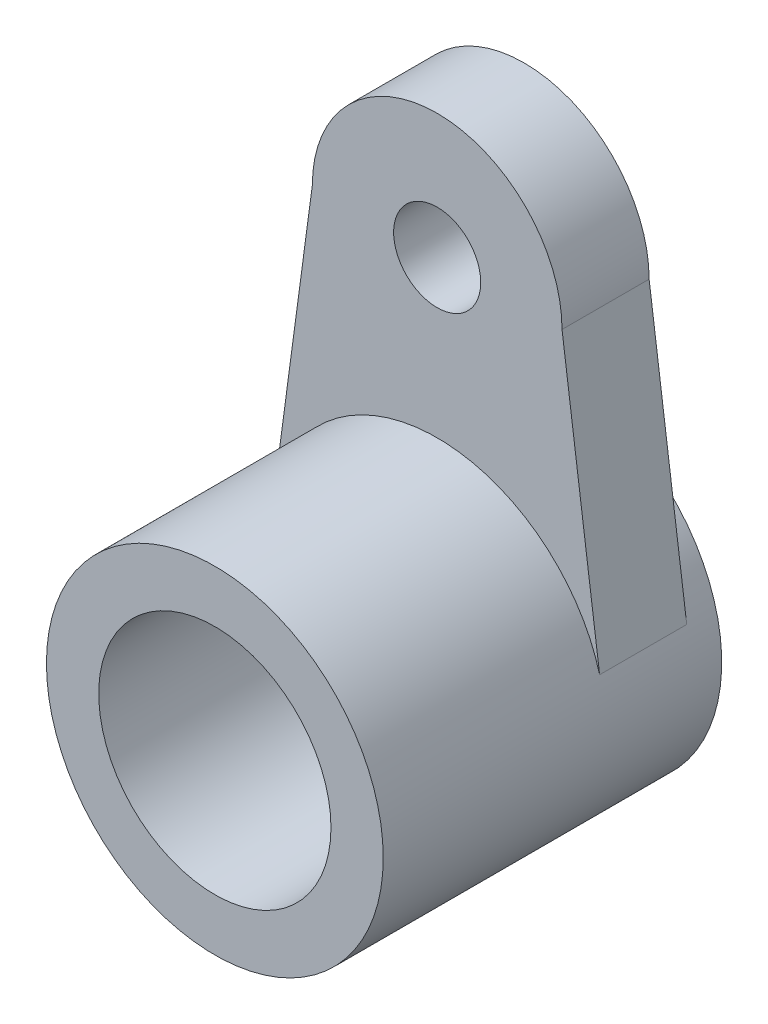
ISO-10303-21;
HEADER;
FILE_DESCRIPTION(('STEP AP214'),'2;1');
FILE_NAME('part.step','',(''),(''),'','','');
FILE_SCHEMA(('AUTOMOTIVE_DESIGN { 1 0 10303 214 1 1 1 1 }'));
ENDSEC;
DATA;
#1=APPLICATION_CONTEXT('core data for automotive mechanical design processes');
#2=APPLICATION_PROTOCOL_DEFINITION('international standard','automotive_design',2000,#1);
#3=PRODUCT_CONTEXT('',#1,'mechanical');
#4=PRODUCT('Part','Part','',(#3));
#5=PRODUCT_RELATED_PRODUCT_CATEGORY('part','',(#4));
#6=PRODUCT_DEFINITION_FORMATION('','',#4);
#7=PRODUCT_DEFINITION_CONTEXT('part definition',#1,'design');
#8=PRODUCT_DEFINITION('design','',#6,#7);
#9=PRODUCT_DEFINITION_SHAPE('','',#8);
#10=(LENGTH_UNIT() NAMED_UNIT(*) SI_UNIT(.MILLI.,.METRE.));
#11=(NAMED_UNIT(*) PLANE_ANGLE_UNIT() SI_UNIT($,.RADIAN.));
#12=(NAMED_UNIT(*) SI_UNIT($,.STERADIAN.) SOLID_ANGLE_UNIT());
#13=UNCERTAINTY_MEASURE_WITH_UNIT(LENGTH_MEASURE(1.E-05),#10,'distance_accuracy_value','');
#14=(GEOMETRIC_REPRESENTATION_CONTEXT(3) GLOBAL_UNCERTAINTY_ASSIGNED_CONTEXT((#13)) GLOBAL_UNIT_ASSIGNED_CONTEXT((#10,
#11,#12)) REPRESENTATION_CONTEXT('',''));
#15=CARTESIAN_POINT('',(0.,0.,0.));
#16=DIRECTION('',(0.,0.,1.));
#17=DIRECTION('',(1.,0.,0.));
#18=AXIS2_PLACEMENT_3D('',#15,#16,#17);
#19=CARTESIAN_POINT('',(0.,-5.59,0.));
#20=DIRECTION('',(0.,0.,1.));
#21=DIRECTION('',(1.,0.,0.));
#22=AXIS2_PLACEMENT_3D('',#19,#20,#21);
#23=PLANE('',#22);
#24=CARTESIAN_POINT('',(0.,0.,0.));
#25=DIRECTION('',(0.,0.,1.));
#26=DIRECTION('',(1.,0.,0.));
#27=AXIS2_PLACEMENT_3D('',#24,#25,#26);
#28=CIRCLE('',#27,0.75);
#29=CARTESIAN_POINT('',(0.75,0.,0.));
#30=VERTEX_POINT('',#29);
#31=EDGE_CURVE('E137',#30,#30,#28,.T.);
#32=ORIENTED_EDGE('',*,*,#31,.T.);
#33=EDGE_LOOP('',(#32));
#34=FACE_BOUND('',#33,.T.);
#35=CARTESIAN_POINT('',(0.,-5.59,0.));
#36=DIRECTION('',(0.,0.,-1.));
#37=DIRECTION('',(-1.,0.,0.));
#38=AXIS2_PLACEMENT_3D('',#35,#36,#37);
#39=CIRCLE('',#38,2.9);
#40=CARTESIAN_POINT('',(-2.79743984709499,-4.82558499368135,0.));
#41=VERTEX_POINT('',#40);
#42=CARTESIAN_POINT('',(2.79743984709499,-4.82558499368136,0.));
#43=VERTEX_POINT('',#42);
#44=EDGE_CURVE('E89',#41,#43,#39,.T.);
#45=ORIENTED_EDGE('',*,*,#44,.F.);
#46=DIRECTION('',(-0.132976633224119,-0.991119172963765,0.));
#47=VECTOR('',#46,1.);
#48=CARTESIAN_POINT('',(-2.15,0.,0.));
#49=LINE('',#48,#47);
#50=CARTESIAN_POINT('',(-2.15,0.,0.));
#51=VERTEX_POINT('',#50);
#52=EDGE_CURVE('E91',#51,#41,#49,.T.);
#53=ORIENTED_EDGE('',*,*,#52,.F.);
#54=CARTESIAN_POINT('',(0.,0.,0.));
#55=DIRECTION('',(0.,0.,1.));
#56=DIRECTION('',(1.,0.,0.));
#57=AXIS2_PLACEMENT_3D('',#54,#55,#56);
#58=CIRCLE('',#57,2.15);
#59=CARTESIAN_POINT('',(2.15,0.,0.));
#60=VERTEX_POINT('',#59);
#61=EDGE_CURVE('E77',#60,#51,#58,.T.);
#62=ORIENTED_EDGE('',*,*,#61,.F.);
#63=DIRECTION('',(-0.132976633224119,0.991119172963765,0.));
#64=VECTOR('',#63,1.);
#65=CARTESIAN_POINT('',(2.15,0.,0.));
#66=LINE('',#65,#64);
#67=EDGE_CURVE('E71',#43,#60,#66,.T.);
#68=ORIENTED_EDGE('',*,*,#67,.F.);
#69=EDGE_LOOP('',(#45,#53,#62,#68));
#70=FACE_BOUND('',#69,.T.);
#71=ADVANCED_FACE('F39',(#34,#70),#23,.F.);
#72=CARTESIAN_POINT('',(0.,-5.59,1.5));
#73=DIRECTION('',(0.,0.,-1.));
#74=DIRECTION('',(-1.,0.,0.));
#75=AXIS2_PLACEMENT_3D('',#72,#73,#74);
#76=CYLINDRICAL_SURFACE('',#75,2.9);
#77=DIRECTION('',(0.,0.,-1.));
#78=VECTOR('',#77,1.);
#79=CARTESIAN_POINT('',(-2.79743984709499,-4.82558499368135,1.5));
#80=LINE('',#79,#78);
#81=CARTESIAN_POINT('',(-2.79743984709499,-4.82558499368135,1.5));
#82=VERTEX_POINT('',#81);
#83=EDGE_CURVE('E99',#82,#41,#80,.T.);
#84=ORIENTED_EDGE('',*,*,#83,.T.);
#85=ORIENTED_EDGE('',*,*,#44,.T.);
#86=DIRECTION('',(0.,0.,-1.));
#87=VECTOR('',#86,1.);
#88=CARTESIAN_POINT('',(2.79743984709499,-4.82558499368136,1.5));
#89=LINE('',#88,#87);
#90=CARTESIAN_POINT('',(2.79743984709499,-4.82558499368136,1.5));
#91=VERTEX_POINT('',#90);
#92=EDGE_CURVE('E11',#91,#43,#89,.T.);
#93=ORIENTED_EDGE('',*,*,#92,.F.);
#94=CARTESIAN_POINT('',(0.,-5.59,1.5));
#95=DIRECTION('',(0.,0.,1.));
#96=DIRECTION('',(1.,0.,0.));
#97=AXIS2_PLACEMENT_3D('',#94,#95,#96);
#98=CIRCLE('',#97,2.9);
#99=EDGE_CURVE('E104',#91,#82,#98,.T.);
#100=ORIENTED_EDGE('',*,*,#99,.T.);
#101=EDGE_LOOP('',(#84,#85,#93,#100));
#102=FACE_BOUND('',#101,.T.);
#103=CARTESIAN_POINT('',(0.,-5.59,5.329));
#104=DIRECTION('',(0.,0.,1.));
#105=DIRECTION('',(1.,0.,0.));
#106=AXIS2_PLACEMENT_3D('',#103,#104,#105);
#107=CIRCLE('',#106,2.9);
#108=CARTESIAN_POINT('',(2.9,-5.59,5.329));
#109=VERTEX_POINT('',#108);
#110=EDGE_CURVE('E113',#109,#109,#107,.T.);
#111=ORIENTED_EDGE('',*,*,#110,.F.);
#112=EDGE_LOOP('',(#111));
#113=FACE_BOUND('',#112,.T.);
#114=CARTESIAN_POINT('',(0.,-5.59,-0.5));
#115=DIRECTION('',(0.,0.,-1.));
#116=DIRECTION('',(-1.,0.,0.));
#117=AXIS2_PLACEMENT_3D('',#114,#115,#116);
#118=CIRCLE('',#117,2.9);
#119=CARTESIAN_POINT('',(-2.9,-5.59,-0.5));
#120=VERTEX_POINT('',#119);
#121=EDGE_CURVE('E94',#120,#120,#118,.T.);
#122=ORIENTED_EDGE('',*,*,#121,.F.);
#123=EDGE_LOOP('',(#122));
#124=FACE_BOUND('',#123,.T.);
#125=ADVANCED_FACE('F41',(#102,#113,#124),#76,.T.);
#126=CARTESIAN_POINT('',(2.15,0.,1.5));
#127=DIRECTION('',(-0.991119172963765,-0.132976633224119,0.));
#128=DIRECTION('',(0.132976633224119,-0.991119172963766,0.));
#129=AXIS2_PLACEMENT_3D('',#126,#127,#128);
#130=PLANE('',#129);
#131=ORIENTED_EDGE('',*,*,#67,.T.);
#132=DIRECTION('',(0.,0.,-1.));
#133=VECTOR('',#132,1.);
#134=CARTESIAN_POINT('',(2.15,0.,1.5));
#135=LINE('',#134,#133);
#136=CARTESIAN_POINT('',(2.15,0.,1.5));
#137=VERTEX_POINT('',#136);
#138=EDGE_CURVE('E49',#137,#60,#135,.T.);
#139=ORIENTED_EDGE('',*,*,#138,.F.);
#140=DIRECTION('',(-0.132976633224119,0.991119172963765,0.));
#141=VECTOR('',#140,1.);
#142=CARTESIAN_POINT('',(2.15,0.,1.5));
#143=LINE('',#142,#141);
#144=EDGE_CURVE('E81',#91,#137,#143,.T.);
#145=ORIENTED_EDGE('',*,*,#144,.F.);
#146=ORIENTED_EDGE('',*,*,#92,.T.);
#147=EDGE_LOOP('',(#131,#139,#145,#146));
#148=FACE_BOUND('',#147,.T.);
#149=ADVANCED_FACE('F167',(#148),#130,.F.);
#150=CARTESIAN_POINT('',(0.,0.,1.5));
#151=DIRECTION('',(0.,0.,-1.));
#152=DIRECTION('',(-1.,0.,0.));
#153=AXIS2_PLACEMENT_3D('',#150,#151,#152);
#154=CYLINDRICAL_SURFACE('',#153,2.15);
#155=ORIENTED_EDGE('',*,*,#61,.T.);
#156=DIRECTION('',(0.,0.,-1.));
#157=VECTOR('',#156,1.);
#158=CARTESIAN_POINT('',(-2.15,0.,1.5));
#159=LINE('',#158,#157);
#160=CARTESIAN_POINT('',(-2.15,0.,1.5));
#161=VERTEX_POINT('',#160);
#162=EDGE_CURVE('E101',#161,#51,#159,.T.);
#163=ORIENTED_EDGE('',*,*,#162,.F.);
#164=CARTESIAN_POINT('',(0.,0.,1.5));
#165=DIRECTION('',(0.,0.,1.));
#166=DIRECTION('',(1.,0.,0.));
#167=AXIS2_PLACEMENT_3D('',#164,#165,#166);
#168=CIRCLE('',#167,2.15);
#169=EDGE_CURVE('E107',#137,#161,#168,.T.);
#170=ORIENTED_EDGE('',*,*,#169,.F.);
#171=ORIENTED_EDGE('',*,*,#138,.T.);
#172=EDGE_LOOP('',(#155,#163,#170,#171));
#173=FACE_BOUND('',#172,.T.);
#174=ADVANCED_FACE('F112',(#173),#154,.T.);
#175=CARTESIAN_POINT('',(-2.15,0.,1.5));
#176=DIRECTION('',(0.991119172963765,-0.132976633224119,0.));
#177=DIRECTION('',(0.132976633224119,0.991119172963766,0.));
#178=AXIS2_PLACEMENT_3D('',#175,#176,#177);
#179=PLANE('',#178);
#180=ORIENTED_EDGE('',*,*,#52,.T.);
#181=ORIENTED_EDGE('',*,*,#83,.F.);
#182=DIRECTION('',(-0.132976633224119,-0.991119172963765,0.));
#183=VECTOR('',#182,1.);
#184=CARTESIAN_POINT('',(-2.15,0.,1.5));
#185=LINE('',#184,#183);
#186=EDGE_CURVE('E57',#161,#82,#185,.T.);
#187=ORIENTED_EDGE('',*,*,#186,.F.);
#188=ORIENTED_EDGE('',*,*,#162,.T.);
#189=EDGE_LOOP('',(#180,#181,#187,#188));
#190=FACE_BOUND('',#189,.T.);
#191=ADVANCED_FACE('F98',(#190),#179,.F.);
#192=CARTESIAN_POINT('',(0.,-5.59,1.5));
#193=DIRECTION('',(0.,0.,1.));
#194=DIRECTION('',(1.,0.,0.));
#195=AXIS2_PLACEMENT_3D('',#192,#193,#194);
#196=PLANE('',#195);
#197=CARTESIAN_POINT('',(0.,0.,1.5));
#198=DIRECTION('',(0.,0.,1.));
#199=DIRECTION('',(1.,0.,0.));
#200=AXIS2_PLACEMENT_3D('',#197,#198,#199);
#201=CIRCLE('',#200,0.75);
#202=CARTESIAN_POINT('',(0.75,0.,1.5));
#203=VERTEX_POINT('',#202);
#204=EDGE_CURVE('E140',#203,#203,#201,.T.);
#205=ORIENTED_EDGE('',*,*,#204,.F.);
#206=EDGE_LOOP('',(#205));
#207=FACE_BOUND('',#206,.T.);
#208=ORIENTED_EDGE('',*,*,#99,.F.);
#209=ORIENTED_EDGE('',*,*,#144,.T.);
#210=ORIENTED_EDGE('',*,*,#169,.T.);
#211=ORIENTED_EDGE('',*,*,#186,.T.);
#212=EDGE_LOOP('',(#208,#209,#210,#211));
#213=FACE_BOUND('',#212,.T.);
#214=ADVANCED_FACE('F147',(#207,#213),#196,.T.);
#215=CARTESIAN_POINT('',(0.,-5.59,5.329));
#216=DIRECTION('',(0.,0.,1.));
#217=DIRECTION('',(1.,0.,0.));
#218=AXIS2_PLACEMENT_3D('',#215,#216,#217);
#219=PLANE('',#218);
#220=CARTESIAN_POINT('',(0.,-5.59,5.329));
#221=DIRECTION('',(0.,0.,1.));
#222=DIRECTION('',(1.,0.,0.));
#223=AXIS2_PLACEMENT_3D('',#220,#221,#222);
#224=CIRCLE('',#223,2.);
#225=CARTESIAN_POINT('',(2.,-5.59,5.329));
#226=VERTEX_POINT('',#225);
#227=EDGE_CURVE('E123',#226,#226,#224,.T.);
#228=ORIENTED_EDGE('',*,*,#227,.F.);
#229=EDGE_LOOP('',(#228));
#230=FACE_BOUND('',#229,.T.);
#231=ORIENTED_EDGE('',*,*,#110,.T.);
#232=EDGE_LOOP('',(#231));
#233=FACE_BOUND('',#232,.T.);
#234=ADVANCED_FACE('F149',(#230,#233),#219,.T.);
#235=CARTESIAN_POINT('',(0.,-5.59,-0.5));
#236=DIRECTION('',(0.,0.,-1.));
#237=DIRECTION('',(-1.,0.,0.));
#238=AXIS2_PLACEMENT_3D('',#235,#236,#237);
#239=PLANE('',#238);
#240=CARTESIAN_POINT('',(0.,-5.59,-0.5));
#241=DIRECTION('',(0.,0.,-1.));
#242=DIRECTION('',(-1.,0.,0.));
#243=AXIS2_PLACEMENT_3D('',#240,#241,#242);
#244=CIRCLE('',#243,2.);
#245=CARTESIAN_POINT('',(-2.,-5.59,-0.5));
#246=VERTEX_POINT('',#245);
#247=EDGE_CURVE('E129',#246,#246,#244,.T.);
#248=ORIENTED_EDGE('',*,*,#247,.F.);
#249=EDGE_LOOP('',(#248));
#250=FACE_BOUND('',#249,.T.);
#251=ORIENTED_EDGE('',*,*,#121,.T.);
#252=EDGE_LOOP('',(#251));
#253=FACE_BOUND('',#252,.T.);
#254=ADVANCED_FACE('F156',(#250,#253),#239,.T.);
#255=CARTESIAN_POINT('',(0.,-5.59,2.329));
#256=DIRECTION('',(0.,0.,1.));
#257=DIRECTION('',(1.,0.,0.));
#258=AXIS2_PLACEMENT_3D('',#255,#256,#257);
#259=CYLINDRICAL_SURFACE('',#258,2.);
#260=CARTESIAN_POINT('',(0.,-5.59,2.329));
#261=DIRECTION('',(0.,0.,1.));
#262=DIRECTION('',(1.,0.,0.));
#263=AXIS2_PLACEMENT_3D('',#260,#261,#262);
#264=CIRCLE('',#263,2.);
#265=CARTESIAN_POINT('',(2.,-5.59,2.329));
#266=VERTEX_POINT('',#265);
#267=EDGE_CURVE('E95',#266,#266,#264,.T.);
#268=ORIENTED_EDGE('',*,*,#267,.F.);
#269=EDGE_LOOP('',(#268));
#270=FACE_BOUND('',#269,.T.);
#271=ORIENTED_EDGE('',*,*,#227,.T.);
#272=EDGE_LOOP('',(#271));
#273=FACE_BOUND('',#272,.T.);
#274=ADVANCED_FACE('F193',(#270,#273),#259,.F.);
#275=CARTESIAN_POINT('',(0.,-5.59,2.329));
#276=DIRECTION('',(0.,0.,1.));
#277=DIRECTION('',(1.,0.,0.));
#278=AXIS2_PLACEMENT_3D('',#275,#276,#277);
#279=PLANE('',#278);
#280=CARTESIAN_POINT('',(0.,-5.59,2.329));
#281=DIRECTION('',(0.,0.,1.));
#282=DIRECTION('',(1.,0.,0.));
#283=AXIS2_PLACEMENT_3D('',#280,#281,#282);
#284=CIRCLE('',#283,1.1);
#285=CARTESIAN_POINT('',(1.1,-5.59,2.329));
#286=VERTEX_POINT('',#285);
#287=EDGE_CURVE('E43',#286,#286,#284,.T.);
#288=ORIENTED_EDGE('',*,*,#287,.F.);
#289=EDGE_LOOP('',(#288));
#290=FACE_BOUND('',#289,.T.);
#291=ORIENTED_EDGE('',*,*,#267,.T.);
#292=EDGE_LOOP('',(#291));
#293=FACE_BOUND('',#292,.T.);
#294=ADVANCED_FACE('F197',(#290,#293),#279,.T.);
#295=CARTESIAN_POINT('',(0.,-5.59,0.2));
#296=DIRECTION('',(0.,0.,-1.));
#297=DIRECTION('',(-1.,0.,0.));
#298=AXIS2_PLACEMENT_3D('',#295,#296,#297);
#299=CYLINDRICAL_SURFACE('',#298,2.);
#300=CARTESIAN_POINT('',(0.,-5.59,0.2));
#301=DIRECTION('',(0.,0.,-1.));
#302=DIRECTION('',(-1.,0.,0.));
#303=AXIS2_PLACEMENT_3D('',#300,#301,#302);
#304=CIRCLE('',#303,2.);
#305=CARTESIAN_POINT('',(-2.,-5.59,0.2));
#306=VERTEX_POINT('',#305);
#307=EDGE_CURVE('E126',#306,#306,#304,.T.);
#308=ORIENTED_EDGE('',*,*,#307,.F.);
#309=EDGE_LOOP('',(#308));
#310=FACE_BOUND('',#309,.T.);
#311=ORIENTED_EDGE('',*,*,#247,.T.);
#312=EDGE_LOOP('',(#311));
#313=FACE_BOUND('',#312,.T.);
#314=ADVANCED_FACE('F212',(#310,#313),#299,.F.);
#315=CARTESIAN_POINT('',(0.,-5.59,0.2));
#316=DIRECTION('',(0.,0.,-1.));
#317=DIRECTION('',(-1.,0.,0.));
#318=AXIS2_PLACEMENT_3D('',#315,#316,#317);
#319=PLANE('',#318);
#320=CARTESIAN_POINT('',(0.,-5.59,0.2));
#321=DIRECTION('',(0.,0.,-1.));
#322=DIRECTION('',(-1.,0.,0.));
#323=AXIS2_PLACEMENT_3D('',#320,#321,#322);
#324=CIRCLE('',#323,1.1);
#325=CARTESIAN_POINT('',(-1.1,-5.59,0.2));
#326=VERTEX_POINT('',#325);
#327=EDGE_CURVE('E134',#326,#326,#324,.T.);
#328=ORIENTED_EDGE('',*,*,#327,.F.);
#329=EDGE_LOOP('',(#328));
#330=FACE_BOUND('',#329,.T.);
#331=ORIENTED_EDGE('',*,*,#307,.T.);
#332=EDGE_LOOP('',(#331));
#333=FACE_BOUND('',#332,.T.);
#334=ADVANCED_FACE('F216',(#330,#333),#319,.T.);
#335=CARTESIAN_POINT('',(0.,-5.59,3.9));
#336=DIRECTION('',(0.,0.,-1.));
#337=DIRECTION('',(-1.,0.,0.));
#338=AXIS2_PLACEMENT_3D('',#335,#336,#337);
#339=CYLINDRICAL_SURFACE('',#338,1.1);
#340=ORIENTED_EDGE('',*,*,#287,.T.);
#341=EDGE_LOOP('',(#340));
#342=FACE_BOUND('',#341,.T.);
#343=ORIENTED_EDGE('',*,*,#327,.T.);
#344=EDGE_LOOP('',(#343));
#345=FACE_BOUND('',#344,.T.);
#346=ADVANCED_FACE('F231',(#342,#345),#339,.F.);
#347=CARTESIAN_POINT('',(0.,0.,-2.2));
#348=DIRECTION('',(0.,0.,1.));
#349=DIRECTION('',(1.,0.,0.));
#350=AXIS2_PLACEMENT_3D('',#347,#348,#349);
#351=CYLINDRICAL_SURFACE('',#350,0.75);
#352=ORIENTED_EDGE('',*,*,#204,.T.);
#353=EDGE_LOOP('',(#352));
#354=FACE_BOUND('',#353,.T.);
#355=ORIENTED_EDGE('',*,*,#31,.F.);
#356=EDGE_LOOP('',(#355));
#357=FACE_BOUND('',#356,.T.);
#358=ADVANCED_FACE('F144',(#354,#357),#351,.F.);
#359=CLOSED_SHELL('',(#71,#125,#149,#174,#191,#214,#234,#254,#274,#294,#314,#334,#346,#358));
#360=MANIFOLD_SOLID_BREP('B2',#359);
#361=ADVANCED_BREP_SHAPE_REPRESENTATION('',(#18,#360),#14);
#362=SHAPE_DEFINITION_REPRESENTATION(#9,#361);
ENDSEC;
END-ISO-10303-21;
